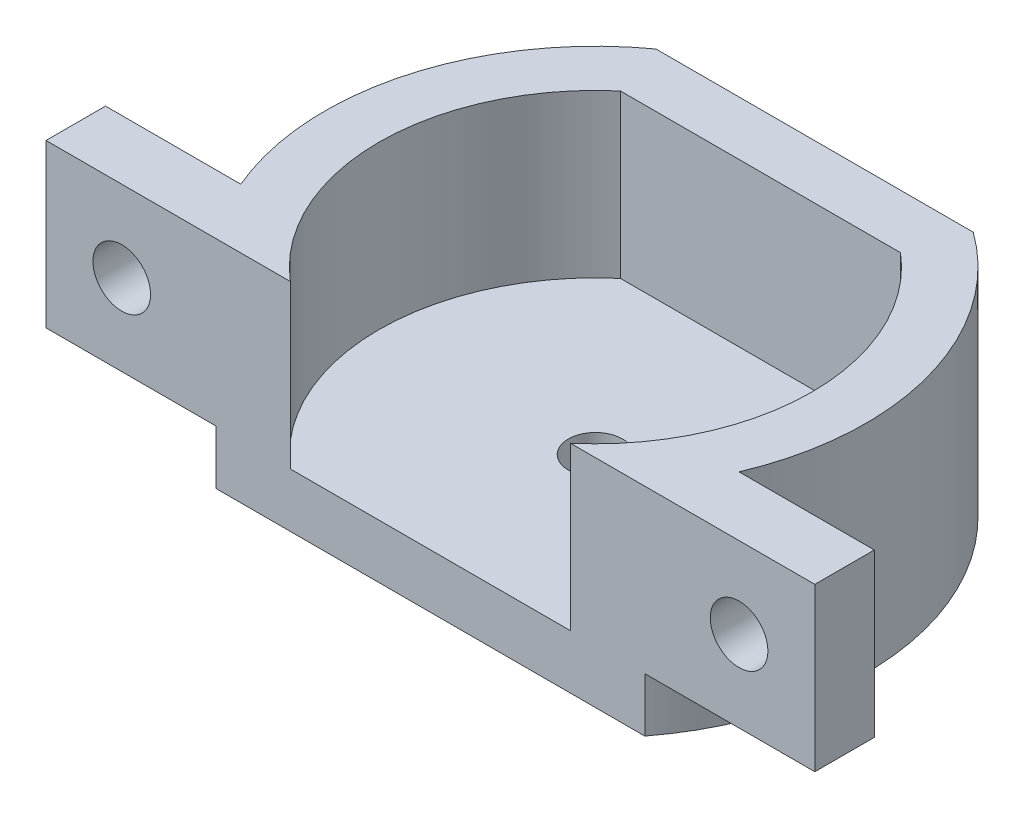
ISO-10303-21;
HEADER;
FILE_DESCRIPTION(('STEP AP214'),'2;1');
FILE_NAME('part.step','',(''),(''),'','','');
FILE_SCHEMA(('AUTOMOTIVE_DESIGN { 1 0 10303 214 1 1 1 1 }'));
ENDSEC;
DATA;
#1=APPLICATION_CONTEXT('core data for automotive mechanical design processes');
#2=APPLICATION_PROTOCOL_DEFINITION('international standard','automotive_design',2000,#1);
#3=PRODUCT_CONTEXT('',#1,'mechanical');
#4=PRODUCT('Part','Part','',(#3));
#5=PRODUCT_RELATED_PRODUCT_CATEGORY('part','',(#4));
#6=PRODUCT_DEFINITION_FORMATION('','',#4);
#7=PRODUCT_DEFINITION_CONTEXT('part definition',#1,'design');
#8=PRODUCT_DEFINITION('design','',#6,#7);
#9=PRODUCT_DEFINITION_SHAPE('','',#8);
#10=(LENGTH_UNIT() NAMED_UNIT(*) SI_UNIT(.MILLI.,.METRE.));
#11=(NAMED_UNIT(*) PLANE_ANGLE_UNIT() SI_UNIT($,.RADIAN.));
#12=(NAMED_UNIT(*) SI_UNIT($,.STERADIAN.) SOLID_ANGLE_UNIT());
#13=UNCERTAINTY_MEASURE_WITH_UNIT(LENGTH_MEASURE(1.E-05),#10,'distance_accuracy_value','');
#14=(GEOMETRIC_REPRESENTATION_CONTEXT(3) GLOBAL_UNCERTAINTY_ASSIGNED_CONTEXT((#13)) GLOBAL_UNIT_ASSIGNED_CONTEXT((#10,
#11,#12)) REPRESENTATION_CONTEXT('',''));
#15=CARTESIAN_POINT('',(0.,0.,0.));
#16=DIRECTION('',(0.,0.,1.));
#17=DIRECTION('',(1.,0.,0.));
#18=AXIS2_PLACEMENT_3D('',#15,#16,#17);
#19=CARTESIAN_POINT('',(0.,0.,0.));
#20=DIRECTION('',(0.,1.,0.));
#21=DIRECTION('',(0.,0.,1.));
#22=AXIS2_PLACEMENT_3D('',#19,#20,#21);
#23=PLANE('',#22);
#24=CARTESIAN_POINT('',(0.,0.,0.));
#25=DIRECTION('',(0.,-1.,0.));
#26=DIRECTION('',(0.,0.,-1.));
#27=AXIS2_PLACEMENT_3D('',#24,#25,#26);
#28=CIRCLE('',#27,12.7);
#29=CARTESIAN_POINT('',(11.6943486778871,0.,4.953));
#30=VERTEX_POINT('',#29);
#31=CARTESIAN_POINT('',(10.063497950514,0.,7.747));
#32=VERTEX_POINT('',#31);
#33=EDGE_CURVE('E11',#30,#32,#28,.T.);
#34=ORIENTED_EDGE('',*,*,#33,.F.);
#35=DIRECTION('',(-1.,0.,0.));
#36=VECTOR('',#35,1.);
#37=CARTESIAN_POINT('',(0.,0.,4.953));
#38=LINE('',#37,#36);
#39=CARTESIAN_POINT('',(18.0443486778871,0.,4.953));
#40=VERTEX_POINT('',#39);
#41=EDGE_CURVE('E164',#40,#30,#38,.T.);
#42=ORIENTED_EDGE('',*,*,#41,.F.);
#43=DIRECTION('',(0.,0.,-1.));
#44=VECTOR('',#43,1.);
#45=CARTESIAN_POINT('',(18.0443486778871,0.,0.));
#46=LINE('',#45,#44);
#47=CARTESIAN_POINT('',(18.0443486778871,0.,7.747));
#48=VERTEX_POINT('',#47);
#49=EDGE_CURVE('E83',#48,#40,#46,.T.);
#50=ORIENTED_EDGE('',*,*,#49,.F.);
#51=DIRECTION('',(1.,0.,0.));
#52=VECTOR('',#51,1.);
#53=CARTESIAN_POINT('',(0.,0.,7.747));
#54=LINE('',#53,#52);
#55=EDGE_CURVE('E76',#32,#48,#54,.T.);
#56=ORIENTED_EDGE('',*,*,#55,.F.);
#57=EDGE_LOOP('',(#34,#42,#50,#56));
#58=FACE_BOUND('',#57,.T.);
#59=ADVANCED_FACE('F36',(#58),#23,.F.);
#60=CARTESIAN_POINT('',(0.,0.,0.));
#61=DIRECTION('',(0.,-1.,0.));
#62=DIRECTION('',(0.,0.,-1.));
#63=AXIS2_PLACEMENT_3D('',#60,#61,#62);
#64=CIRCLE('',#63,12.7);
#65=CARTESIAN_POINT('',(-10.063497950514,0.,7.747));
#66=VERTEX_POINT('',#65);
#67=CARTESIAN_POINT('',(-11.6943486778871,0.,4.953));
#68=VERTEX_POINT('',#67);
#69=EDGE_CURVE('E215',#66,#68,#64,.T.);
#70=ORIENTED_EDGE('',*,*,#69,.F.);
#71=DIRECTION('',(-1.,0.,0.));
#72=VECTOR('',#71,1.);
#73=CARTESIAN_POINT('',(0.,0.,7.747));
#74=LINE('',#73,#72);
#75=CARTESIAN_POINT('',(-18.0443486778871,0.,7.747));
#76=VERTEX_POINT('',#75);
#77=EDGE_CURVE('E151',#66,#76,#74,.T.);
#78=ORIENTED_EDGE('',*,*,#77,.T.);
#79=DIRECTION('',(0.,0.,-1.));
#80=VECTOR('',#79,1.);
#81=CARTESIAN_POINT('',(-18.0443486778871,0.,0.));
#82=LINE('',#81,#80);
#83=CARTESIAN_POINT('',(-18.0443486778871,0.,4.953));
#84=VERTEX_POINT('',#83);
#85=EDGE_CURVE('E147',#76,#84,#82,.T.);
#86=ORIENTED_EDGE('',*,*,#85,.T.);
#87=DIRECTION('',(1.,0.,0.));
#88=VECTOR('',#87,1.);
#89=CARTESIAN_POINT('',(0.,0.,4.953));
#90=LINE('',#89,#88);
#91=EDGE_CURVE('E144',#84,#68,#90,.T.);
#92=ORIENTED_EDGE('',*,*,#91,.T.);
#93=EDGE_LOOP('',(#70,#78,#86,#92));
#94=FACE_BOUND('',#93,.T.);
#95=ADVANCED_FACE('F298',(#94),#23,.F.);
#96=CARTESIAN_POINT('',(0.,7.62,-10.287));
#97=DIRECTION('',(0.,0.,-1.));
#98=DIRECTION('',(-1.,0.,0.));
#99=AXIS2_PLACEMENT_3D('',#96,#97,#98);
#100=PLANE('',#99);
#101=DIRECTION('',(0.,-1.,0.));
#102=VECTOR('',#101,1.);
#103=CARTESIAN_POINT('',(7.44765943098904,7.62,-10.287));
#104=LINE('',#103,#102);
#105=CARTESIAN_POINT('',(7.44765943098904,7.62,-10.287));
#106=VERTEX_POINT('',#105);
#107=CARTESIAN_POINT('',(7.44765943098904,-2.54,-10.287));
#108=VERTEX_POINT('',#107);
#109=EDGE_CURVE('E140',#106,#108,#104,.T.);
#110=ORIENTED_EDGE('',*,*,#109,.T.);
#111=DIRECTION('',(1.,0.,0.));
#112=VECTOR('',#111,1.);
#113=CARTESIAN_POINT('',(7.44765943098904,-2.54,-10.287));
#114=LINE('',#113,#112);
#115=CARTESIAN_POINT('',(-7.44765943098904,-2.54,-10.287));
#116=VERTEX_POINT('',#115);
#117=EDGE_CURVE('E221',#116,#108,#114,.T.);
#118=ORIENTED_EDGE('',*,*,#117,.F.);
#119=DIRECTION('',(0.,-1.,0.));
#120=VECTOR('',#119,1.);
#121=CARTESIAN_POINT('',(-7.44765943098904,7.62,-10.287));
#122=LINE('',#121,#120);
#123=CARTESIAN_POINT('',(-7.44765943098904,7.62,-10.287));
#124=VERTEX_POINT('',#123);
#125=EDGE_CURVE('E46',#124,#116,#122,.T.);
#126=ORIENTED_EDGE('',*,*,#125,.F.);
#127=DIRECTION('',(1.,0.,0.));
#128=VECTOR('',#127,1.);
#129=CARTESIAN_POINT('',(0.,7.62,-10.287));
#130=LINE('',#129,#128);
#131=EDGE_CURVE('E166',#124,#106,#130,.T.);
#132=ORIENTED_EDGE('',*,*,#131,.T.);
#133=EDGE_LOOP('',(#110,#118,#126,#132));
#134=FACE_BOUND('',#133,.T.);
#135=ADVANCED_FACE('F38',(#134),#100,.T.);
#136=CARTESIAN_POINT('',(0.,7.62,0.));
#137=DIRECTION('',(0.,-1.,0.));
#138=DIRECTION('',(0.,0.,-1.));
#139=AXIS2_PLACEMENT_3D('',#136,#137,#138);
#140=CYLINDRICAL_SURFACE('',#139,12.7);
#141=ORIENTED_EDGE('',*,*,#125,.T.);
#142=CARTESIAN_POINT('',(0.,-2.54,0.));
#143=DIRECTION('',(0.,-1.,0.));
#144=DIRECTION('',(0.,0.,-1.));
#145=AXIS2_PLACEMENT_3D('',#142,#143,#144);
#146=CIRCLE('',#145,12.7);
#147=CARTESIAN_POINT('',(-10.063497950514,-2.54,7.747));
#148=VERTEX_POINT('',#147);
#149=EDGE_CURVE('E218',#148,#116,#146,.T.);
#150=ORIENTED_EDGE('',*,*,#149,.F.);
#151=DIRECTION('',(0.,1.,0.));
#152=VECTOR('',#151,1.);
#153=CARTESIAN_POINT('',(-10.063497950514,-2.54,7.747));
#154=LINE('',#153,#152);
#155=EDGE_CURVE('E223',#148,#66,#154,.T.);
#156=ORIENTED_EDGE('',*,*,#155,.T.);
#157=ORIENTED_EDGE('',*,*,#69,.T.);
#158=DIRECTION('',(0.,-1.,0.));
#159=VECTOR('',#158,1.);
#160=CARTESIAN_POINT('',(-11.6943486778871,7.62,4.953));
#161=LINE('',#160,#159);
#162=CARTESIAN_POINT('',(-11.6943486778871,7.62,4.953));
#163=VERTEX_POINT('',#162);
#164=EDGE_CURVE('E188',#163,#68,#161,.T.);
#165=ORIENTED_EDGE('',*,*,#164,.F.);
#166=CARTESIAN_POINT('',(0.,7.62,0.));
#167=DIRECTION('',(0.,1.,0.));
#168=DIRECTION('',(0.,0.,1.));
#169=AXIS2_PLACEMENT_3D('',#166,#167,#168);
#170=CIRCLE('',#169,12.7);
#171=EDGE_CURVE('E232',#124,#163,#170,.T.);
#172=ORIENTED_EDGE('',*,*,#171,.F.);
#173=EDGE_LOOP('',(#141,#150,#156,#157,#165,#172));
#174=FACE_BOUND('',#173,.T.);
#175=ADVANCED_FACE('F331',(#174),#140,.T.);
#176=CARTESIAN_POINT('',(0.,7.62,4.953));
#177=DIRECTION('',(0.,0.,-1.));
#178=DIRECTION('',(-1.,0.,0.));
#179=AXIS2_PLACEMENT_3D('',#176,#177,#178);
#180=PLANE('',#179);
#181=CARTESIAN_POINT('',(-14.4883486778871,3.81,4.953));
#182=DIRECTION('',(0.,0.,-1.));
#183=DIRECTION('',(-1.,0.,0.));
#184=AXIS2_PLACEMENT_3D('',#181,#182,#183);
#185=CIRCLE('',#184,1.35255);
#186=CARTESIAN_POINT('',(-15.8408986778871,3.81,4.953));
#187=VERTEX_POINT('',#186);
#188=EDGE_CURVE('E194',#187,#187,#185,.T.);
#189=ORIENTED_EDGE('',*,*,#188,.F.);
#190=EDGE_LOOP('',(#189));
#191=FACE_BOUND('',#190,.T.);
#192=ORIENTED_EDGE('',*,*,#91,.F.);
#193=DIRECTION('',(0.,-1.,0.));
#194=VECTOR('',#193,1.);
#195=CARTESIAN_POINT('',(-18.0443486778871,7.62,4.953));
#196=LINE('',#195,#194);
#197=CARTESIAN_POINT('',(-18.0443486778871,7.62,4.953));
#198=VERTEX_POINT('',#197);
#199=EDGE_CURVE('E186',#198,#84,#196,.T.);
#200=ORIENTED_EDGE('',*,*,#199,.F.);
#201=DIRECTION('',(1.,0.,0.));
#202=VECTOR('',#201,1.);
#203=CARTESIAN_POINT('',(0.,7.62,4.953));
#204=LINE('',#203,#202);
#205=EDGE_CURVE('E234',#198,#163,#204,.T.);
#206=ORIENTED_EDGE('',*,*,#205,.T.);
#207=ORIENTED_EDGE('',*,*,#164,.T.);
#208=EDGE_LOOP('',(#192,#200,#206,#207));
#209=FACE_BOUND('',#208,.T.);
#210=ADVANCED_FACE('F328',(#191,#209),#180,.T.);
#211=CARTESIAN_POINT('',(-18.0443486778871,7.62,0.));
#212=DIRECTION('',(-1.,0.,0.));
#213=DIRECTION('',(0.,0.,1.));
#214=AXIS2_PLACEMENT_3D('',#211,#212,#213);
#215=PLANE('',#214);
#216=ORIENTED_EDGE('',*,*,#85,.F.);
#217=DIRECTION('',(0.,-1.,0.));
#218=VECTOR('',#217,1.);
#219=CARTESIAN_POINT('',(-18.0443486778871,7.62,7.747));
#220=LINE('',#219,#218);
#221=CARTESIAN_POINT('',(-18.0443486778871,7.62,7.747));
#222=VERTEX_POINT('',#221);
#223=EDGE_CURVE('E183',#222,#76,#220,.T.);
#224=ORIENTED_EDGE('',*,*,#223,.F.);
#225=DIRECTION('',(0.,0.,-1.));
#226=VECTOR('',#225,1.);
#227=CARTESIAN_POINT('',(-18.0443486778871,7.62,0.));
#228=LINE('',#227,#226);
#229=EDGE_CURVE('E237',#222,#198,#228,.T.);
#230=ORIENTED_EDGE('',*,*,#229,.T.);
#231=ORIENTED_EDGE('',*,*,#199,.T.);
#232=EDGE_LOOP('',(#216,#224,#230,#231));
#233=FACE_BOUND('',#232,.T.);
#234=ADVANCED_FACE('F324',(#233),#215,.T.);
#235=CARTESIAN_POINT('',(0.,7.62,0.));
#236=DIRECTION('',(0.,-1.,0.));
#237=DIRECTION('',(0.,0.,-1.));
#238=AXIS2_PLACEMENT_3D('',#235,#236,#237);
#239=CYLINDRICAL_SURFACE('',#238,10.16);
#240=CARTESIAN_POINT('',(0.,0.,0.));
#241=DIRECTION('',(0.,1.,0.));
#242=DIRECTION('',(0.,0.,1.));
#243=AXIS2_PLACEMENT_3D('',#240,#241,#242);
#244=CIRCLE('',#243,10.16);
#245=CARTESIAN_POINT('',(-6.57340026166063,0.,-7.747));
#246=VERTEX_POINT('',#245);
#247=CARTESIAN_POINT('',(-6.57340026166063,0.,7.747));
#248=VERTEX_POINT('',#247);
#249=EDGE_CURVE('E153',#246,#248,#244,.T.);
#250=ORIENTED_EDGE('',*,*,#249,.F.);
#251=DIRECTION('',(0.,-1.,0.));
#252=VECTOR('',#251,1.);
#253=CARTESIAN_POINT('',(-6.57340026166063,7.62,-7.747));
#254=LINE('',#253,#252);
#255=CARTESIAN_POINT('',(-6.57340026166063,7.62,-7.747));
#256=VERTEX_POINT('',#255);
#257=EDGE_CURVE('E177',#256,#246,#254,.T.);
#258=ORIENTED_EDGE('',*,*,#257,.F.);
#259=CARTESIAN_POINT('',(0.,7.62,0.));
#260=DIRECTION('',(0.,1.,0.));
#261=DIRECTION('',(0.,0.,1.));
#262=AXIS2_PLACEMENT_3D('',#259,#260,#261);
#263=CIRCLE('',#262,10.16);
#264=CARTESIAN_POINT('',(-6.57340026166063,7.62,7.747));
#265=VERTEX_POINT('',#264);
#266=EDGE_CURVE('E243',#256,#265,#263,.T.);
#267=ORIENTED_EDGE('',*,*,#266,.T.);
#268=DIRECTION('',(0.,-1.,0.));
#269=VECTOR('',#268,1.);
#270=CARTESIAN_POINT('',(-6.57340026166063,7.62,7.747));
#271=LINE('',#270,#269);
#272=EDGE_CURVE('E180',#265,#248,#271,.T.);
#273=ORIENTED_EDGE('',*,*,#272,.T.);
#274=EDGE_LOOP('',(#250,#258,#267,#273));
#275=FACE_BOUND('',#274,.T.);
#276=ADVANCED_FACE('F321',(#275),#239,.F.);
#277=CARTESIAN_POINT('',(0.,7.62,-7.747));
#278=DIRECTION('',(0.,0.,1.));
#279=DIRECTION('',(1.,0.,0.));
#280=AXIS2_PLACEMENT_3D('',#277,#278,#279);
#281=PLANE('',#280);
#282=DIRECTION('',(-1.,0.,0.));
#283=VECTOR('',#282,1.);
#284=CARTESIAN_POINT('',(0.,0.,-7.747));
#285=LINE('',#284,#283);
#286=CARTESIAN_POINT('',(6.57340026166063,0.,-7.747));
#287=VERTEX_POINT('',#286);
#288=EDGE_CURVE('E156',#287,#246,#285,.T.);
#289=ORIENTED_EDGE('',*,*,#288,.F.);
#290=DIRECTION('',(0.,-1.,0.));
#291=VECTOR('',#290,1.);
#292=CARTESIAN_POINT('',(6.57340026166063,7.62,-7.747));
#293=LINE('',#292,#291);
#294=CARTESIAN_POINT('',(6.57340026166063,7.62,-7.747));
#295=VERTEX_POINT('',#294);
#296=EDGE_CURVE('E174',#295,#287,#293,.T.);
#297=ORIENTED_EDGE('',*,*,#296,.F.);
#298=DIRECTION('',(-1.,0.,0.));
#299=VECTOR('',#298,1.);
#300=CARTESIAN_POINT('',(0.,7.62,-7.747));
#301=LINE('',#300,#299);
#302=EDGE_CURVE('E246',#295,#256,#301,.T.);
#303=ORIENTED_EDGE('',*,*,#302,.T.);
#304=ORIENTED_EDGE('',*,*,#257,.T.);
#305=EDGE_LOOP('',(#289,#297,#303,#304));
#306=FACE_BOUND('',#305,.T.);
#307=ADVANCED_FACE('F259',(#306),#281,.T.);
#308=CARTESIAN_POINT('',(0.,7.62,0.));
#309=DIRECTION('',(0.,-1.,0.));
#310=DIRECTION('',(0.,0.,-1.));
#311=AXIS2_PLACEMENT_3D('',#308,#309,#310);
#312=CYLINDRICAL_SURFACE('',#311,10.16);
#313=CARTESIAN_POINT('',(0.,0.,0.));
#314=DIRECTION('',(0.,1.,0.));
#315=DIRECTION('',(0.,0.,1.));
#316=AXIS2_PLACEMENT_3D('',#313,#314,#315);
#317=CIRCLE('',#316,10.16);
#318=CARTESIAN_POINT('',(6.57340026166063,0.,7.747));
#319=VERTEX_POINT('',#318);
#320=EDGE_CURVE('E159',#319,#287,#317,.T.);
#321=ORIENTED_EDGE('',*,*,#320,.F.);
#322=DIRECTION('',(0.,-1.,0.));
#323=VECTOR('',#322,1.);
#324=CARTESIAN_POINT('',(6.57340026166063,7.62,7.747));
#325=LINE('',#324,#323);
#326=CARTESIAN_POINT('',(6.57340026166063,7.62,7.747));
#327=VERTEX_POINT('',#326);
#328=EDGE_CURVE('E171',#327,#319,#325,.T.);
#329=ORIENTED_EDGE('',*,*,#328,.F.);
#330=CARTESIAN_POINT('',(0.,7.62,0.));
#331=DIRECTION('',(0.,1.,0.));
#332=DIRECTION('',(0.,0.,1.));
#333=AXIS2_PLACEMENT_3D('',#330,#331,#332);
#334=CIRCLE('',#333,10.16);
#335=EDGE_CURVE('E249',#327,#295,#334,.T.);
#336=ORIENTED_EDGE('',*,*,#335,.T.);
#337=ORIENTED_EDGE('',*,*,#296,.T.);
#338=EDGE_LOOP('',(#321,#329,#336,#337));
#339=FACE_BOUND('',#338,.T.);
#340=ADVANCED_FACE('F253',(#339),#312,.F.);
#341=CARTESIAN_POINT('',(0.,7.62,7.747));
#342=DIRECTION('',(0.,0.,-1.));
#343=DIRECTION('',(-1.,0.,0.));
#344=AXIS2_PLACEMENT_3D('',#341,#342,#343);
#345=PLANE('',#344);
#346=CARTESIAN_POINT('',(14.4883486778871,3.81,7.747));
#347=DIRECTION('',(0.,0.,-1.));
#348=DIRECTION('',(-1.,0.,0.));
#349=AXIS2_PLACEMENT_3D('',#346,#347,#348);
#350=CIRCLE('',#349,1.35255);
#351=CARTESIAN_POINT('',(13.1357986778871,3.81,7.747));
#352=VERTEX_POINT('',#351);
#353=EDGE_CURVE('E40',#352,#352,#350,.T.);
#354=ORIENTED_EDGE('',*,*,#353,.T.);
#355=EDGE_LOOP('',(#354));
#356=FACE_BOUND('',#355,.T.);
#357=CARTESIAN_POINT('',(-14.4883486778871,3.81,7.747));
#358=DIRECTION('',(0.,0.,-1.));
#359=DIRECTION('',(-1.,0.,0.));
#360=AXIS2_PLACEMENT_3D('',#357,#358,#359);
#361=CIRCLE('',#360,1.35255);
#362=CARTESIAN_POINT('',(-15.8408986778871,3.81,7.747));
#363=VERTEX_POINT('',#362);
#364=EDGE_CURVE('E191',#363,#363,#361,.T.);
#365=ORIENTED_EDGE('',*,*,#364,.T.);
#366=EDGE_LOOP('',(#365));
#367=FACE_BOUND('',#366,.T.);
#368=ORIENTED_EDGE('',*,*,#328,.T.);
#369=DIRECTION('',(-1.,0.,0.));
#370=VECTOR('',#369,1.);
#371=CARTESIAN_POINT('',(-10.063497950514,0.,7.747));
#372=LINE('',#371,#370);
#373=EDGE_CURVE('E209',#319,#248,#372,.T.);
#374=ORIENTED_EDGE('',*,*,#373,.T.);
#375=ORIENTED_EDGE('',*,*,#272,.F.);
#376=DIRECTION('',(-1.,0.,0.));
#377=VECTOR('',#376,1.);
#378=CARTESIAN_POINT('',(0.,7.62,7.747));
#379=LINE('',#378,#377);
#380=EDGE_CURVE('E240',#265,#222,#379,.T.);
#381=ORIENTED_EDGE('',*,*,#380,.T.);
#382=ORIENTED_EDGE('',*,*,#223,.T.);
#383=ORIENTED_EDGE('',*,*,#77,.F.);
#384=ORIENTED_EDGE('',*,*,#155,.F.);
#385=DIRECTION('',(-1.,0.,0.));
#386=VECTOR('',#385,1.);
#387=CARTESIAN_POINT('',(-10.063497950514,-2.54,7.747));
#388=LINE('',#387,#386);
#389=CARTESIAN_POINT('',(10.063497950514,-2.54,7.747));
#390=VERTEX_POINT('',#389);
#391=EDGE_CURVE('E214',#390,#148,#388,.T.);
#392=ORIENTED_EDGE('',*,*,#391,.F.);
#393=DIRECTION('',(0.,1.,0.));
#394=VECTOR('',#393,1.);
#395=CARTESIAN_POINT('',(10.063497950514,-2.54,7.747));
#396=LINE('',#395,#394);
#397=EDGE_CURVE('E148',#390,#32,#396,.T.);
#398=ORIENTED_EDGE('',*,*,#397,.T.);
#399=ORIENTED_EDGE('',*,*,#55,.T.);
#400=DIRECTION('',(0.,-1.,0.));
#401=VECTOR('',#400,1.);
#402=CARTESIAN_POINT('',(18.0443486778871,7.62,7.747));
#403=LINE('',#402,#401);
#404=CARTESIAN_POINT('',(18.0443486778871,7.62,7.747));
#405=VERTEX_POINT('',#404);
#406=EDGE_CURVE('E134',#405,#48,#403,.T.);
#407=ORIENTED_EDGE('',*,*,#406,.F.);
#408=DIRECTION('',(1.,0.,0.));
#409=VECTOR('',#408,1.);
#410=CARTESIAN_POINT('',(0.,7.62,7.747));
#411=LINE('',#410,#409);
#412=EDGE_CURVE('E127',#327,#405,#411,.T.);
#413=ORIENTED_EDGE('',*,*,#412,.F.);
#414=EDGE_LOOP('',(#368,#374,#375,#381,#382,#383,#384,#392,#398,#399,#407,#413));
#415=FACE_BOUND('',#414,.T.);
#416=ADVANCED_FACE('F286',(#356,#367,#415),#345,.F.);
#417=CARTESIAN_POINT('',(18.0443486778871,7.62,0.));
#418=DIRECTION('',(-1.,0.,0.));
#419=DIRECTION('',(0.,0.,1.));
#420=AXIS2_PLACEMENT_3D('',#417,#418,#419);
#421=PLANE('',#420);
#422=ORIENTED_EDGE('',*,*,#49,.T.);
#423=DIRECTION('',(0.,-1.,0.));
#424=VECTOR('',#423,1.);
#425=CARTESIAN_POINT('',(18.0443486778871,7.62,4.953));
#426=LINE('',#425,#424);
#427=CARTESIAN_POINT('',(18.0443486778871,7.62,4.953));
#428=VERTEX_POINT('',#427);
#429=EDGE_CURVE('E129',#428,#40,#426,.T.);
#430=ORIENTED_EDGE('',*,*,#429,.F.);
#431=DIRECTION('',(0.,0.,-1.));
#432=VECTOR('',#431,1.);
#433=CARTESIAN_POINT('',(18.0443486778871,7.62,0.));
#434=LINE('',#433,#432);
#435=EDGE_CURVE('E120',#405,#428,#434,.T.);
#436=ORIENTED_EDGE('',*,*,#435,.F.);
#437=ORIENTED_EDGE('',*,*,#406,.T.);
#438=EDGE_LOOP('',(#422,#430,#436,#437));
#439=FACE_BOUND('',#438,.T.);
#440=ADVANCED_FACE('F130',(#439),#421,.F.);
#441=CARTESIAN_POINT('',(0.,7.62,4.953));
#442=DIRECTION('',(0.,0.,1.));
#443=DIRECTION('',(1.,0.,0.));
#444=AXIS2_PLACEMENT_3D('',#441,#442,#443);
#445=PLANE('',#444);
#446=CARTESIAN_POINT('',(14.4883486778871,3.81,4.953));
#447=DIRECTION('',(0.,0.,-1.));
#448=DIRECTION('',(-1.,0.,0.));
#449=AXIS2_PLACEMENT_3D('',#446,#447,#448);
#450=CIRCLE('',#449,1.35255);
#451=CARTESIAN_POINT('',(13.1357986778871,3.81,4.953));
#452=VERTEX_POINT('',#451);
#453=EDGE_CURVE('E205',#452,#452,#450,.T.);
#454=ORIENTED_EDGE('',*,*,#453,.F.);
#455=EDGE_LOOP('',(#454));
#456=FACE_BOUND('',#455,.T.);
#457=ORIENTED_EDGE('',*,*,#41,.T.);
#458=DIRECTION('',(0.,-1.,0.));
#459=VECTOR('',#458,1.);
#460=CARTESIAN_POINT('',(11.6943486778871,7.62,4.953));
#461=LINE('',#460,#459);
#462=CARTESIAN_POINT('',(11.6943486778871,7.62,4.953));
#463=VERTEX_POINT('',#462);
#464=EDGE_CURVE('E135',#463,#30,#461,.T.);
#465=ORIENTED_EDGE('',*,*,#464,.F.);
#466=DIRECTION('',(-1.,0.,0.));
#467=VECTOR('',#466,1.);
#468=CARTESIAN_POINT('',(0.,7.62,4.953));
#469=LINE('',#468,#467);
#470=EDGE_CURVE('E123',#428,#463,#469,.T.);
#471=ORIENTED_EDGE('',*,*,#470,.F.);
#472=ORIENTED_EDGE('',*,*,#429,.T.);
#473=EDGE_LOOP('',(#457,#465,#471,#472));
#474=FACE_BOUND('',#473,.T.);
#475=ADVANCED_FACE('F137',(#456,#474),#445,.F.);
#476=CARTESIAN_POINT('',(0.,7.62,0.));
#477=DIRECTION('',(0.,-1.,0.));
#478=DIRECTION('',(0.,0.,-1.));
#479=AXIS2_PLACEMENT_3D('',#476,#477,#478);
#480=CYLINDRICAL_SURFACE('',#479,12.7);
#481=ORIENTED_EDGE('',*,*,#464,.T.);
#482=ORIENTED_EDGE('',*,*,#33,.T.);
#483=ORIENTED_EDGE('',*,*,#397,.F.);
#484=CARTESIAN_POINT('',(0.,-2.54,0.));
#485=DIRECTION('',(0.,-1.,0.));
#486=DIRECTION('',(0.,0.,-1.));
#487=AXIS2_PLACEMENT_3D('',#484,#485,#486);
#488=CIRCLE('',#487,12.7);
#489=EDGE_CURVE('E211',#108,#390,#488,.T.);
#490=ORIENTED_EDGE('',*,*,#489,.F.);
#491=ORIENTED_EDGE('',*,*,#109,.F.);
#492=CARTESIAN_POINT('',(0.,7.62,0.));
#493=DIRECTION('',(0.,1.,0.));
#494=DIRECTION('',(0.,0.,1.));
#495=AXIS2_PLACEMENT_3D('',#492,#493,#494);
#496=CIRCLE('',#495,12.7);
#497=EDGE_CURVE('E55',#463,#106,#496,.T.);
#498=ORIENTED_EDGE('',*,*,#497,.F.);
#499=EDGE_LOOP('',(#481,#482,#483,#490,#491,#498));
#500=FACE_BOUND('',#499,.T.);
#501=ADVANCED_FACE('F295',(#500),#480,.T.);
#502=CARTESIAN_POINT('',(0.,7.62,0.));
#503=DIRECTION('',(0.,1.,0.));
#504=DIRECTION('',(0.,0.,1.));
#505=AXIS2_PLACEMENT_3D('',#502,#503,#504);
#506=PLANE('',#505);
#507=ORIENTED_EDGE('',*,*,#131,.F.);
#508=ORIENTED_EDGE('',*,*,#171,.T.);
#509=ORIENTED_EDGE('',*,*,#205,.F.);
#510=ORIENTED_EDGE('',*,*,#229,.F.);
#511=ORIENTED_EDGE('',*,*,#380,.F.);
#512=ORIENTED_EDGE('',*,*,#266,.F.);
#513=ORIENTED_EDGE('',*,*,#302,.F.);
#514=ORIENTED_EDGE('',*,*,#335,.F.);
#515=ORIENTED_EDGE('',*,*,#412,.T.);
#516=ORIENTED_EDGE('',*,*,#435,.T.);
#517=ORIENTED_EDGE('',*,*,#470,.T.);
#518=ORIENTED_EDGE('',*,*,#497,.T.);
#519=EDGE_LOOP('',(#507,#508,#509,#510,#511,#512,#513,#514,#515,#516,#517,#518));
#520=FACE_BOUND('',#519,.T.);
#521=ADVANCED_FACE('F121',(#520),#506,.T.);
#522=CARTESIAN_POINT('',(0.,0.,0.));
#523=DIRECTION('',(0.,-1.,0.));
#524=DIRECTION('',(0.,0.,-1.));
#525=AXIS2_PLACEMENT_3D('',#522,#523,#524);
#526=PLANE('',#525);
#527=CARTESIAN_POINT('',(0.,0.,0.));
#528=DIRECTION('',(0.,-1.,0.));
#529=DIRECTION('',(0.,0.,-1.));
#530=AXIS2_PLACEMENT_3D('',#527,#528,#529);
#531=CIRCLE('',#530,1.27);
#532=CARTESIAN_POINT('',(0.,0.,-1.27));
#533=VERTEX_POINT('',#532);
#534=EDGE_CURVE('E193',#533,#533,#531,.T.);
#535=ORIENTED_EDGE('',*,*,#534,.T.);
#536=EDGE_LOOP('',(#535));
#537=FACE_BOUND('',#536,.T.);
#538=ORIENTED_EDGE('',*,*,#373,.F.);
#539=ORIENTED_EDGE('',*,*,#320,.T.);
#540=ORIENTED_EDGE('',*,*,#288,.T.);
#541=ORIENTED_EDGE('',*,*,#249,.T.);
#542=EDGE_LOOP('',(#538,#539,#540,#541));
#543=FACE_BOUND('',#542,.T.);
#544=ADVANCED_FACE('F264',(#537,#543),#526,.F.);
#545=CARTESIAN_POINT('',(0.,-2.54,0.));
#546=DIRECTION('',(0.,-1.,0.));
#547=DIRECTION('',(0.,0.,-1.));
#548=AXIS2_PLACEMENT_3D('',#545,#546,#547);
#549=PLANE('',#548);
#550=ORIENTED_EDGE('',*,*,#489,.T.);
#551=ORIENTED_EDGE('',*,*,#391,.T.);
#552=ORIENTED_EDGE('',*,*,#149,.T.);
#553=ORIENTED_EDGE('',*,*,#117,.T.);
#554=EDGE_LOOP('',(#550,#551,#552,#553));
#555=FACE_BOUND('',#554,.T.);
#556=CARTESIAN_POINT('',(0.,-2.54,0.));
#557=DIRECTION('',(0.,-1.,0.));
#558=DIRECTION('',(0.,0.,-1.));
#559=AXIS2_PLACEMENT_3D('',#556,#557,#558);
#560=CIRCLE('',#559,1.27);
#561=CARTESIAN_POINT('',(0.,-2.54,-1.27));
#562=VERTEX_POINT('',#561);
#563=EDGE_CURVE('E198',#562,#562,#560,.T.);
#564=ORIENTED_EDGE('',*,*,#563,.F.);
#565=EDGE_LOOP('',(#564));
#566=FACE_BOUND('',#565,.T.);
#567=ADVANCED_FACE('F292',(#555,#566),#549,.T.);
#568=CARTESIAN_POINT('',(0.,-2.54,0.));
#569=DIRECTION('',(0.,1.,0.));
#570=DIRECTION('',(0.,0.,1.));
#571=AXIS2_PLACEMENT_3D('',#568,#569,#570);
#572=CYLINDRICAL_SURFACE('',#571,1.27);
#573=ORIENTED_EDGE('',*,*,#563,.T.);
#574=EDGE_LOOP('',(#573));
#575=FACE_BOUND('',#574,.T.);
#576=ORIENTED_EDGE('',*,*,#534,.F.);
#577=EDGE_LOOP('',(#576));
#578=FACE_BOUND('',#577,.T.);
#579=ADVANCED_FACE('F420',(#575,#578),#572,.F.);
#580=CARTESIAN_POINT('',(-14.4883486778871,3.81,4.953));
#581=DIRECTION('',(0.,0.,-1.));
#582=DIRECTION('',(-1.,0.,0.));
#583=AXIS2_PLACEMENT_3D('',#580,#581,#582);
#584=CYLINDRICAL_SURFACE('',#583,1.35255);
#585=ORIENTED_EDGE('',*,*,#188,.T.);
#586=EDGE_LOOP('',(#585));
#587=FACE_BOUND('',#586,.T.);
#588=ORIENTED_EDGE('',*,*,#364,.F.);
#589=EDGE_LOOP('',(#588));
#590=FACE_BOUND('',#589,.T.);
#591=ADVANCED_FACE('F414',(#587,#590),#584,.F.);
#592=CARTESIAN_POINT('',(14.4883486778871,3.81,4.953));
#593=DIRECTION('',(0.,0.,-1.));
#594=DIRECTION('',(-1.,0.,0.));
#595=AXIS2_PLACEMENT_3D('',#592,#593,#594);
#596=CYLINDRICAL_SURFACE('',#595,1.35255);
#597=ORIENTED_EDGE('',*,*,#453,.T.);
#598=EDGE_LOOP('',(#597));
#599=FACE_BOUND('',#598,.T.);
#600=ORIENTED_EDGE('',*,*,#353,.F.);
#601=EDGE_LOOP('',(#600));
#602=FACE_BOUND('',#601,.T.);
#603=ADVANCED_FACE('F419',(#599,#602),#596,.F.);
#604=CLOSED_SHELL('',(#59,#95,#135,#175,#210,#234,#276,#307,#340,#416,#440,#475,#501,#521,#544,
#567,#579,#591,#603));
#605=MANIFOLD_SOLID_BREP('B2',#604);
#606=ADVANCED_BREP_SHAPE_REPRESENTATION('',(#18,#605),#14);
#607=SHAPE_DEFINITION_REPRESENTATION(#9,#606);
ENDSEC;
END-ISO-10303-21;
